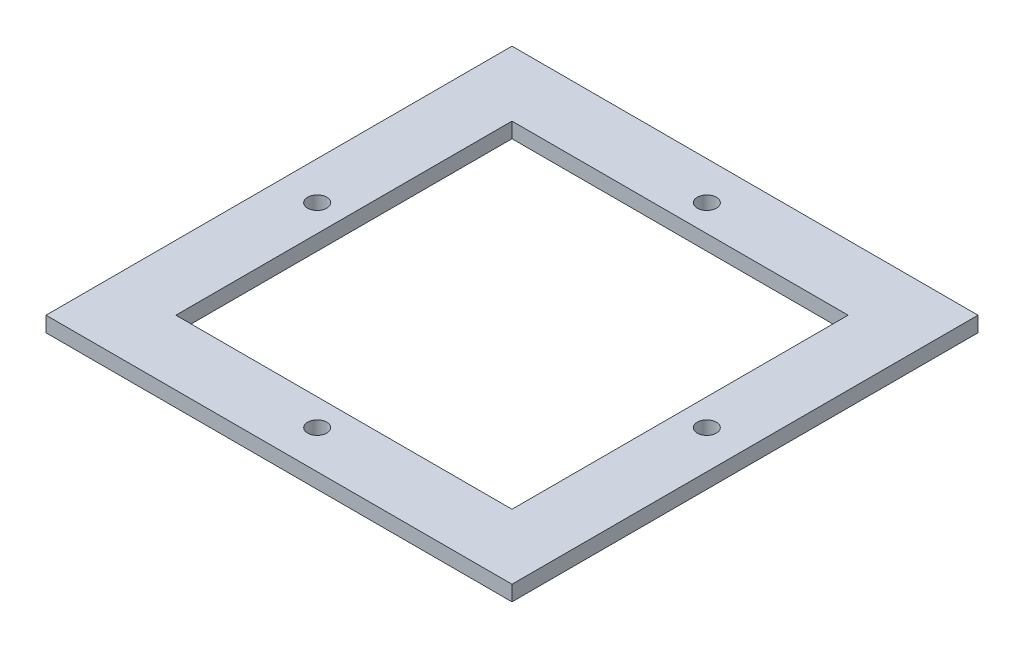
ISO-10303-21;
HEADER;
FILE_DESCRIPTION(('STEP AP214'),'2;1');
FILE_NAME('part.step','',(''),(''),'','','');
FILE_SCHEMA(('AUTOMOTIVE_DESIGN { 1 0 10303 214 1 1 1 1 }'));
ENDSEC;
DATA;
#1=APPLICATION_CONTEXT('core data for automotive mechanical design processes');
#2=APPLICATION_PROTOCOL_DEFINITION('international standard','automotive_design',2000,#1);
#3=PRODUCT_CONTEXT('',#1,'mechanical');
#4=PRODUCT('Part','Part','',(#3));
#5=PRODUCT_RELATED_PRODUCT_CATEGORY('part','',(#4));
#6=PRODUCT_DEFINITION_FORMATION('','',#4);
#7=PRODUCT_DEFINITION_CONTEXT('part definition',#1,'design');
#8=PRODUCT_DEFINITION('design','',#6,#7);
#9=PRODUCT_DEFINITION_SHAPE('','',#8);
#10=(LENGTH_UNIT() NAMED_UNIT(*) SI_UNIT(.MILLI.,.METRE.));
#11=(NAMED_UNIT(*) PLANE_ANGLE_UNIT() SI_UNIT($,.RADIAN.));
#12=(NAMED_UNIT(*) SI_UNIT($,.STERADIAN.) SOLID_ANGLE_UNIT());
#13=UNCERTAINTY_MEASURE_WITH_UNIT(LENGTH_MEASURE(1.E-05),#10,'distance_accuracy_value','');
#14=(GEOMETRIC_REPRESENTATION_CONTEXT(3) GLOBAL_UNCERTAINTY_ASSIGNED_CONTEXT((#13)) GLOBAL_UNIT_ASSIGNED_CONTEXT((#10,
#11,#12)) REPRESENTATION_CONTEXT('',''));
#15=CARTESIAN_POINT('',(0.,0.,0.));
#16=DIRECTION('',(0.,0.,1.));
#17=DIRECTION('',(1.,0.,0.));
#18=AXIS2_PLACEMENT_3D('',#15,#16,#17);
#19=CARTESIAN_POINT('',(0.,4.,-44.0000000000001));
#20=DIRECTION('',(0.,0.,1.));
#21=DIRECTION('',(1.,0.,0.));
#22=AXIS2_PLACEMENT_3D('',#19,#20,#21);
#23=PLANE('',#22);
#24=DIRECTION('',(-1.,0.,0.));
#25=VECTOR('',#24,1.);
#26=CARTESIAN_POINT('',(0.,0.,-44.0000000000001));
#27=LINE('',#26,#25);
#28=CARTESIAN_POINT('',(43.9999999999999,0.,-44.0000000000001));
#29=VERTEX_POINT('',#28);
#30=CARTESIAN_POINT('',(-44.0000000000001,0.,-44.0000000000001));
#31=VERTEX_POINT('',#30);
#32=EDGE_CURVE('E163',#29,#31,#27,.T.);
#33=ORIENTED_EDGE('',*,*,#32,.F.);
#34=DIRECTION('',(0.,-1.,0.));
#35=VECTOR('',#34,1.);
#36=CARTESIAN_POINT('',(43.9999999999999,4.,-44.0000000000001));
#37=LINE('',#36,#35);
#38=CARTESIAN_POINT('',(43.9999999999999,4.,-44.0000000000001));
#39=VERTEX_POINT('',#38);
#40=EDGE_CURVE('E11',#39,#29,#37,.T.);
#41=ORIENTED_EDGE('',*,*,#40,.F.);
#42=DIRECTION('',(-1.,0.,0.));
#43=VECTOR('',#42,1.);
#44=CARTESIAN_POINT('',(0.,4.,-44.0000000000001));
#45=LINE('',#44,#43);
#46=CARTESIAN_POINT('',(-44.0000000000001,4.,-44.0000000000001));
#47=VERTEX_POINT('',#46);
#48=EDGE_CURVE('E131',#39,#47,#45,.T.);
#49=ORIENTED_EDGE('',*,*,#48,.T.);
#50=DIRECTION('',(0.,-1.,0.));
#51=VECTOR('',#50,1.);
#52=CARTESIAN_POINT('',(-44.0000000000001,4.,-44.0000000000001));
#53=LINE('',#52,#51);
#54=EDGE_CURVE('E91',#47,#31,#53,.T.);
#55=ORIENTED_EDGE('',*,*,#54,.T.);
#56=EDGE_LOOP('',(#33,#41,#49,#55));
#57=FACE_BOUND('',#56,.T.);
#58=ADVANCED_FACE('F37',(#57),#23,.T.);
#59=CARTESIAN_POINT('',(43.9999999999999,4.,0.));
#60=DIRECTION('',(-1.,0.,0.));
#61=DIRECTION('',(0.,0.,1.));
#62=AXIS2_PLACEMENT_3D('',#59,#60,#61);
#63=PLANE('',#62);
#64=DIRECTION('',(0.,0.,-1.));
#65=VECTOR('',#64,1.);
#66=CARTESIAN_POINT('',(43.9999999999999,0.,0.));
#67=LINE('',#66,#65);
#68=CARTESIAN_POINT('',(43.9999999999999,0.,43.9999999999999));
#69=VERTEX_POINT('',#68);
#70=EDGE_CURVE('E120',#69,#29,#67,.T.);
#71=ORIENTED_EDGE('',*,*,#70,.F.);
#72=DIRECTION('',(0.,-1.,0.));
#73=VECTOR('',#72,1.);
#74=CARTESIAN_POINT('',(43.9999999999999,4.,43.9999999999999));
#75=LINE('',#74,#73);
#76=CARTESIAN_POINT('',(43.9999999999999,4.,43.9999999999999));
#77=VERTEX_POINT('',#76);
#78=EDGE_CURVE('E47',#77,#69,#75,.T.);
#79=ORIENTED_EDGE('',*,*,#78,.F.);
#80=DIRECTION('',(0.,0.,-1.));
#81=VECTOR('',#80,1.);
#82=CARTESIAN_POINT('',(43.9999999999999,4.,0.));
#83=LINE('',#82,#81);
#84=EDGE_CURVE('E118',#77,#39,#83,.T.);
#85=ORIENTED_EDGE('',*,*,#84,.T.);
#86=ORIENTED_EDGE('',*,*,#40,.T.);
#87=EDGE_LOOP('',(#71,#79,#85,#86));
#88=FACE_BOUND('',#87,.T.);
#89=ADVANCED_FACE('F116',(#88),#63,.T.);
#90=CARTESIAN_POINT('',(0.,4.,43.9999999999999));
#91=DIRECTION('',(0.,0.,1.));
#92=DIRECTION('',(1.,0.,0.));
#93=AXIS2_PLACEMENT_3D('',#90,#91,#92);
#94=PLANE('',#93);
#95=DIRECTION('',(-1.,0.,0.));
#96=VECTOR('',#95,1.);
#97=CARTESIAN_POINT('',(0.,0.,43.9999999999999));
#98=LINE('',#97,#96);
#99=CARTESIAN_POINT('',(-44.0000000000001,0.,43.9999999999999));
#100=VERTEX_POINT('',#99);
#101=EDGE_CURVE('E166',#69,#100,#98,.T.);
#102=ORIENTED_EDGE('',*,*,#101,.T.);
#103=DIRECTION('',(0.,-1.,0.));
#104=VECTOR('',#103,1.);
#105=CARTESIAN_POINT('',(-44.0000000000001,4.,43.9999999999999));
#106=LINE('',#105,#104);
#107=CARTESIAN_POINT('',(-44.0000000000001,4.,43.9999999999999));
#108=VERTEX_POINT('',#107);
#109=EDGE_CURVE('E123',#108,#100,#106,.T.);
#110=ORIENTED_EDGE('',*,*,#109,.F.);
#111=DIRECTION('',(-1.,0.,0.));
#112=VECTOR('',#111,1.);
#113=CARTESIAN_POINT('',(0.,4.,43.9999999999999));
#114=LINE('',#113,#112);
#115=EDGE_CURVE('E126',#77,#108,#114,.T.);
#116=ORIENTED_EDGE('',*,*,#115,.F.);
#117=ORIENTED_EDGE('',*,*,#78,.T.);
#118=EDGE_LOOP('',(#102,#110,#116,#117));
#119=FACE_BOUND('',#118,.T.);
#120=ADVANCED_FACE('F127',(#119),#94,.F.);
#121=CARTESIAN_POINT('',(61.,4.,0.));
#122=DIRECTION('',(-1.,0.,0.));
#123=DIRECTION('',(0.,0.,1.));
#124=AXIS2_PLACEMENT_3D('',#121,#122,#123);
#125=PLANE('',#124);
#126=DIRECTION('',(0.,0.,-1.));
#127=VECTOR('',#126,1.);
#128=CARTESIAN_POINT('',(61.,0.,0.));
#129=LINE('',#128,#127);
#130=CARTESIAN_POINT('',(61.,0.,61.));
#131=VERTEX_POINT('',#130);
#132=CARTESIAN_POINT('',(61.,0.,-61.));
#133=VERTEX_POINT('',#132);
#134=EDGE_CURVE('E145',#131,#133,#129,.T.);
#135=ORIENTED_EDGE('',*,*,#134,.T.);
#136=DIRECTION('',(0.,-1.,0.));
#137=VECTOR('',#136,1.);
#138=CARTESIAN_POINT('',(61.,4.,-61.));
#139=LINE('',#138,#137);
#140=CARTESIAN_POINT('',(61.,4.,-61.));
#141=VERTEX_POINT('',#140);
#142=EDGE_CURVE('E41',#141,#133,#139,.T.);
#143=ORIENTED_EDGE('',*,*,#142,.F.);
#144=DIRECTION('',(0.,0.,-1.));
#145=VECTOR('',#144,1.);
#146=CARTESIAN_POINT('',(61.,4.,0.));
#147=LINE('',#146,#145);
#148=CARTESIAN_POINT('',(61.,4.,61.));
#149=VERTEX_POINT('',#148);
#150=EDGE_CURVE('E175',#149,#141,#147,.T.);
#151=ORIENTED_EDGE('',*,*,#150,.F.);
#152=DIRECTION('',(0.,-1.,0.));
#153=VECTOR('',#152,1.);
#154=CARTESIAN_POINT('',(61.,4.,61.));
#155=LINE('',#154,#153);
#156=EDGE_CURVE('E144',#149,#131,#155,.T.);
#157=ORIENTED_EDGE('',*,*,#156,.T.);
#158=EDGE_LOOP('',(#135,#143,#151,#157));
#159=FACE_BOUND('',#158,.T.);
#160=ADVANCED_FACE('F39',(#159),#125,.F.);
#161=CARTESIAN_POINT('',(0.,4.,-61.));
#162=DIRECTION('',(0.,0.,1.));
#163=DIRECTION('',(1.,0.,0.));
#164=AXIS2_PLACEMENT_3D('',#161,#162,#163);
#165=PLANE('',#164);
#166=DIRECTION('',(-1.,0.,0.));
#167=VECTOR('',#166,1.);
#168=CARTESIAN_POINT('',(0.,0.,-61.));
#169=LINE('',#168,#167);
#170=CARTESIAN_POINT('',(-61.,0.,-61.));
#171=VERTEX_POINT('',#170);
#172=EDGE_CURVE('E148',#133,#171,#169,.T.);
#173=ORIENTED_EDGE('',*,*,#172,.T.);
#174=DIRECTION('',(0.,-1.,0.));
#175=VECTOR('',#174,1.);
#176=CARTESIAN_POINT('',(-61.,4.,-61.));
#177=LINE('',#176,#175);
#178=CARTESIAN_POINT('',(-61.,4.,-61.));
#179=VERTEX_POINT('',#178);
#180=EDGE_CURVE('E180',#179,#171,#177,.T.);
#181=ORIENTED_EDGE('',*,*,#180,.F.);
#182=DIRECTION('',(-1.,0.,0.));
#183=VECTOR('',#182,1.);
#184=CARTESIAN_POINT('',(0.,4.,-61.));
#185=LINE('',#184,#183);
#186=EDGE_CURVE('E99',#141,#179,#185,.T.);
#187=ORIENTED_EDGE('',*,*,#186,.F.);
#188=ORIENTED_EDGE('',*,*,#142,.T.);
#189=EDGE_LOOP('',(#173,#181,#187,#188));
#190=FACE_BOUND('',#189,.T.);
#191=ADVANCED_FACE('F185',(#190),#165,.F.);
#192=CARTESIAN_POINT('',(-61.,4.,0.));
#193=DIRECTION('',(-1.,0.,0.));
#194=DIRECTION('',(0.,0.,1.));
#195=AXIS2_PLACEMENT_3D('',#192,#193,#194);
#196=PLANE('',#195);
#197=DIRECTION('',(0.,0.,-1.));
#198=VECTOR('',#197,1.);
#199=CARTESIAN_POINT('',(-61.,0.,0.));
#200=LINE('',#199,#198);
#201=CARTESIAN_POINT('',(-61.,0.,61.));
#202=VERTEX_POINT('',#201);
#203=EDGE_CURVE('E151',#202,#171,#200,.T.);
#204=ORIENTED_EDGE('',*,*,#203,.F.);
#205=DIRECTION('',(0.,-1.,0.));
#206=VECTOR('',#205,1.);
#207=CARTESIAN_POINT('',(-61.,4.,61.));
#208=LINE('',#207,#206);
#209=CARTESIAN_POINT('',(-61.,4.,61.));
#210=VERTEX_POINT('',#209);
#211=EDGE_CURVE('E179',#210,#202,#208,.T.);
#212=ORIENTED_EDGE('',*,*,#211,.F.);
#213=DIRECTION('',(0.,0.,-1.));
#214=VECTOR('',#213,1.);
#215=CARTESIAN_POINT('',(-61.,4.,0.));
#216=LINE('',#215,#214);
#217=EDGE_CURVE('E357',#210,#179,#216,.T.);
#218=ORIENTED_EDGE('',*,*,#217,.T.);
#219=ORIENTED_EDGE('',*,*,#180,.T.);
#220=EDGE_LOOP('',(#204,#212,#218,#219));
#221=FACE_BOUND('',#220,.T.);
#222=ADVANCED_FACE('F199',(#221),#196,.T.);
#223=CARTESIAN_POINT('',(0.,4.,51.));
#224=DIRECTION('',(0.,-1.,0.));
#225=DIRECTION('',(0.,0.,-1.));
#226=AXIS2_PLACEMENT_3D('',#223,#224,#225);
#227=CYLINDRICAL_SURFACE('',#226,2.49999999999998);
#228=CARTESIAN_POINT('',(0.,4.,51.));
#229=DIRECTION('',(0.,1.,0.));
#230=DIRECTION('',(0.,0.,1.));
#231=AXIS2_PLACEMENT_3D('',#228,#229,#230);
#232=CIRCLE('',#231,2.49999999999998);
#233=CARTESIAN_POINT('',(0.,4.,53.5));
#234=VERTEX_POINT('',#233);
#235=EDGE_CURVE('E138',#234,#234,#232,.F.);
#236=ORIENTED_EDGE('',*,*,#235,.F.);
#237=EDGE_LOOP('',(#236));
#238=FACE_BOUND('',#237,.T.);
#239=CARTESIAN_POINT('',(0.,0.,51.));
#240=DIRECTION('',(0.,1.,0.));
#241=DIRECTION('',(0.,0.,1.));
#242=AXIS2_PLACEMENT_3D('',#239,#240,#241);
#243=CIRCLE('',#242,2.49999999999998);
#244=CARTESIAN_POINT('',(0.,0.,53.5));
#245=VERTEX_POINT('',#244);
#246=EDGE_CURVE('E169',#245,#245,#243,.F.);
#247=ORIENTED_EDGE('',*,*,#246,.T.);
#248=EDGE_LOOP('',(#247));
#249=FACE_BOUND('',#248,.T.);
#250=ADVANCED_FACE('F201',(#238,#249),#227,.F.);
#251=CARTESIAN_POINT('',(-44.0000000000001,4.,0.));
#252=DIRECTION('',(-1.,0.,0.));
#253=DIRECTION('',(0.,0.,1.));
#254=AXIS2_PLACEMENT_3D('',#251,#252,#253);
#255=PLANE('',#254);
#256=DIRECTION('',(0.,0.,-1.));
#257=VECTOR('',#256,1.);
#258=CARTESIAN_POINT('',(-44.0000000000001,0.,0.));
#259=LINE('',#258,#257);
#260=EDGE_CURVE('E84',#100,#31,#259,.T.);
#261=ORIENTED_EDGE('',*,*,#260,.T.);
#262=ORIENTED_EDGE('',*,*,#54,.F.);
#263=DIRECTION('',(0.,0.,-1.));
#264=VECTOR('',#263,1.);
#265=CARTESIAN_POINT('',(-44.0000000000001,4.,0.));
#266=LINE('',#265,#264);
#267=EDGE_CURVE('E56',#108,#47,#266,.T.);
#268=ORIENTED_EDGE('',*,*,#267,.F.);
#269=ORIENTED_EDGE('',*,*,#109,.T.);
#270=EDGE_LOOP('',(#261,#262,#268,#269));
#271=FACE_BOUND('',#270,.T.);
#272=ADVANCED_FACE('F207',(#271),#255,.F.);
#273=CARTESIAN_POINT('',(0.,4.,-51.));
#274=DIRECTION('',(0.,-1.,0.));
#275=DIRECTION('',(0.,0.,-1.));
#276=AXIS2_PLACEMENT_3D('',#273,#274,#275);
#277=CYLINDRICAL_SURFACE('',#276,2.5);
#278=CARTESIAN_POINT('',(0.,4.,-51.));
#279=DIRECTION('',(0.,1.,0.));
#280=DIRECTION('',(0.,0.,1.));
#281=AXIS2_PLACEMENT_3D('',#278,#279,#280);
#282=CIRCLE('',#281,2.5);
#283=CARTESIAN_POINT('',(0.,4.,-48.5));
#284=VERTEX_POINT('',#283);
#285=EDGE_CURVE('E133',#284,#284,#282,.T.);
#286=ORIENTED_EDGE('',*,*,#285,.T.);
#287=EDGE_LOOP('',(#286));
#288=FACE_BOUND('',#287,.T.);
#289=CARTESIAN_POINT('',(0.,0.,-51.));
#290=DIRECTION('',(0.,1.,0.));
#291=DIRECTION('',(0.,0.,1.));
#292=AXIS2_PLACEMENT_3D('',#289,#290,#291);
#293=CIRCLE('',#292,2.5);
#294=CARTESIAN_POINT('',(0.,0.,-48.5));
#295=VERTEX_POINT('',#294);
#296=EDGE_CURVE('E160',#295,#295,#293,.T.);
#297=ORIENTED_EDGE('',*,*,#296,.F.);
#298=EDGE_LOOP('',(#297));
#299=FACE_BOUND('',#298,.T.);
#300=ADVANCED_FACE('F219',(#288,#299),#277,.F.);
#301=CARTESIAN_POINT('',(51.,4.,0.));
#302=DIRECTION('',(0.,-1.,0.));
#303=DIRECTION('',(0.,0.,-1.));
#304=AXIS2_PLACEMENT_3D('',#301,#302,#303);
#305=CYLINDRICAL_SURFACE('',#304,2.5);
#306=CARTESIAN_POINT('',(51.,4.,0.));
#307=DIRECTION('',(0.,1.,0.));
#308=DIRECTION('',(0.,0.,1.));
#309=AXIS2_PLACEMENT_3D('',#306,#307,#308);
#310=CIRCLE('',#309,2.5);
#311=CARTESIAN_POINT('',(51.,4.,2.5));
#312=VERTEX_POINT('',#311);
#313=EDGE_CURVE('E351',#312,#312,#310,.F.);
#314=ORIENTED_EDGE('',*,*,#313,.F.);
#315=EDGE_LOOP('',(#314));
#316=FACE_BOUND('',#315,.T.);
#317=CARTESIAN_POINT('',(51.,0.,0.));
#318=DIRECTION('',(0.,1.,0.));
#319=DIRECTION('',(0.,0.,1.));
#320=AXIS2_PLACEMENT_3D('',#317,#318,#319);
#321=CIRCLE('',#320,2.5);
#322=CARTESIAN_POINT('',(51.,0.,2.5));
#323=VERTEX_POINT('',#322);
#324=EDGE_CURVE('E157',#323,#323,#321,.F.);
#325=ORIENTED_EDGE('',*,*,#324,.T.);
#326=EDGE_LOOP('',(#325));
#327=FACE_BOUND('',#326,.T.);
#328=ADVANCED_FACE('F222',(#316,#327),#305,.F.);
#329=CARTESIAN_POINT('',(0.,4.,61.));
#330=DIRECTION('',(0.,0.,1.));
#331=DIRECTION('',(1.,0.,0.));
#332=AXIS2_PLACEMENT_3D('',#329,#330,#331);
#333=PLANE('',#332);
#334=DIRECTION('',(-1.,0.,0.));
#335=VECTOR('',#334,1.);
#336=CARTESIAN_POINT('',(0.,0.,61.));
#337=LINE('',#336,#335);
#338=EDGE_CURVE('E154',#131,#202,#337,.T.);
#339=ORIENTED_EDGE('',*,*,#338,.F.);
#340=ORIENTED_EDGE('',*,*,#156,.F.);
#341=DIRECTION('',(-1.,0.,0.));
#342=VECTOR('',#341,1.);
#343=CARTESIAN_POINT('',(0.,4.,61.));
#344=LINE('',#343,#342);
#345=EDGE_CURVE('E197',#149,#210,#344,.T.);
#346=ORIENTED_EDGE('',*,*,#345,.T.);
#347=ORIENTED_EDGE('',*,*,#211,.T.);
#348=EDGE_LOOP('',(#339,#340,#346,#347));
#349=FACE_BOUND('',#348,.T.);
#350=ADVANCED_FACE('F194',(#349),#333,.T.);
#351=CARTESIAN_POINT('',(-51.,4.,0.));
#352=DIRECTION('',(0.,-1.,0.));
#353=DIRECTION('',(0.,0.,-1.));
#354=AXIS2_PLACEMENT_3D('',#351,#352,#353);
#355=CYLINDRICAL_SURFACE('',#354,2.5);
#356=CARTESIAN_POINT('',(-51.,4.,0.));
#357=DIRECTION('',(0.,1.,0.));
#358=DIRECTION('',(0.,0.,1.));
#359=AXIS2_PLACEMENT_3D('',#356,#357,#358);
#360=CIRCLE('',#359,2.5);
#361=CARTESIAN_POINT('',(-51.,4.,2.5));
#362=VERTEX_POINT('',#361);
#363=EDGE_CURVE('E141',#362,#362,#360,.T.);
#364=ORIENTED_EDGE('',*,*,#363,.T.);
#365=EDGE_LOOP('',(#364));
#366=FACE_BOUND('',#365,.T.);
#367=CARTESIAN_POINT('',(-51.,0.,0.));
#368=DIRECTION('',(0.,1.,0.));
#369=DIRECTION('',(0.,0.,1.));
#370=AXIS2_PLACEMENT_3D('',#367,#368,#369);
#371=CIRCLE('',#370,2.5);
#372=CARTESIAN_POINT('',(-51.,0.,2.5));
#373=VERTEX_POINT('',#372);
#374=EDGE_CURVE('E172',#373,#373,#371,.T.);
#375=ORIENTED_EDGE('',*,*,#374,.F.);
#376=EDGE_LOOP('',(#375));
#377=FACE_BOUND('',#376,.T.);
#378=ADVANCED_FACE('F227',(#366,#377),#355,.F.);
#379=CARTESIAN_POINT('',(0.,4.,0.));
#380=DIRECTION('',(0.,1.,0.));
#381=DIRECTION('',(0.,0.,1.));
#382=AXIS2_PLACEMENT_3D('',#379,#380,#381);
#383=PLANE('',#382);
#384=ORIENTED_EDGE('',*,*,#150,.T.);
#385=ORIENTED_EDGE('',*,*,#186,.T.);
#386=ORIENTED_EDGE('',*,*,#217,.F.);
#387=ORIENTED_EDGE('',*,*,#345,.F.);
#388=EDGE_LOOP('',(#384,#385,#386,#387));
#389=FACE_BOUND('',#388,.T.);
#390=ORIENTED_EDGE('',*,*,#313,.T.);
#391=EDGE_LOOP('',(#390));
#392=FACE_BOUND('',#391,.T.);
#393=ORIENTED_EDGE('',*,*,#285,.F.);
#394=EDGE_LOOP('',(#393));
#395=FACE_BOUND('',#394,.T.);
#396=ORIENTED_EDGE('',*,*,#48,.F.);
#397=ORIENTED_EDGE('',*,*,#84,.F.);
#398=ORIENTED_EDGE('',*,*,#115,.T.);
#399=ORIENTED_EDGE('',*,*,#267,.T.);
#400=EDGE_LOOP('',(#396,#397,#398,#399));
#401=FACE_BOUND('',#400,.T.);
#402=ORIENTED_EDGE('',*,*,#235,.T.);
#403=EDGE_LOOP('',(#402));
#404=FACE_BOUND('',#403,.T.);
#405=ORIENTED_EDGE('',*,*,#363,.F.);
#406=EDGE_LOOP('',(#405));
#407=FACE_BOUND('',#406,.T.);
#408=ADVANCED_FACE('F129',(#389,#392,#395,#401,#404,#407),#383,.T.);
#409=CARTESIAN_POINT('',(0.,0.,0.));
#410=DIRECTION('',(0.,1.,0.));
#411=DIRECTION('',(0.,0.,1.));
#412=AXIS2_PLACEMENT_3D('',#409,#410,#411);
#413=PLANE('',#412);
#414=ORIENTED_EDGE('',*,*,#134,.F.);
#415=ORIENTED_EDGE('',*,*,#338,.T.);
#416=ORIENTED_EDGE('',*,*,#203,.T.);
#417=ORIENTED_EDGE('',*,*,#172,.F.);
#418=EDGE_LOOP('',(#414,#415,#416,#417));
#419=FACE_BOUND('',#418,.T.);
#420=ORIENTED_EDGE('',*,*,#324,.F.);
#421=EDGE_LOOP('',(#420));
#422=FACE_BOUND('',#421,.T.);
#423=ORIENTED_EDGE('',*,*,#296,.T.);
#424=EDGE_LOOP('',(#423));
#425=FACE_BOUND('',#424,.T.);
#426=ORIENTED_EDGE('',*,*,#32,.T.);
#427=ORIENTED_EDGE('',*,*,#260,.F.);
#428=ORIENTED_EDGE('',*,*,#101,.F.);
#429=ORIENTED_EDGE('',*,*,#70,.T.);
#430=EDGE_LOOP('',(#426,#427,#428,#429));
#431=FACE_BOUND('',#430,.T.);
#432=ORIENTED_EDGE('',*,*,#246,.F.);
#433=EDGE_LOOP('',(#432));
#434=FACE_BOUND('',#433,.T.);
#435=ORIENTED_EDGE('',*,*,#374,.T.);
#436=EDGE_LOOP('',(#435));
#437=FACE_BOUND('',#436,.T.);
#438=ADVANCED_FACE('F191',(#419,#422,#425,#431,#434,#437),#413,.F.);
#439=CLOSED_SHELL('',(#58,#89,#120,#160,#191,#222,#250,#272,#300,#328,#350,#378,#408,#438));
#440=MANIFOLD_SOLID_BREP('B2',#439);
#441=ADVANCED_BREP_SHAPE_REPRESENTATION('',(#18,#440),#14);
#442=SHAPE_DEFINITION_REPRESENTATION(#9,#441);
ENDSEC;
END-ISO-10303-21;
